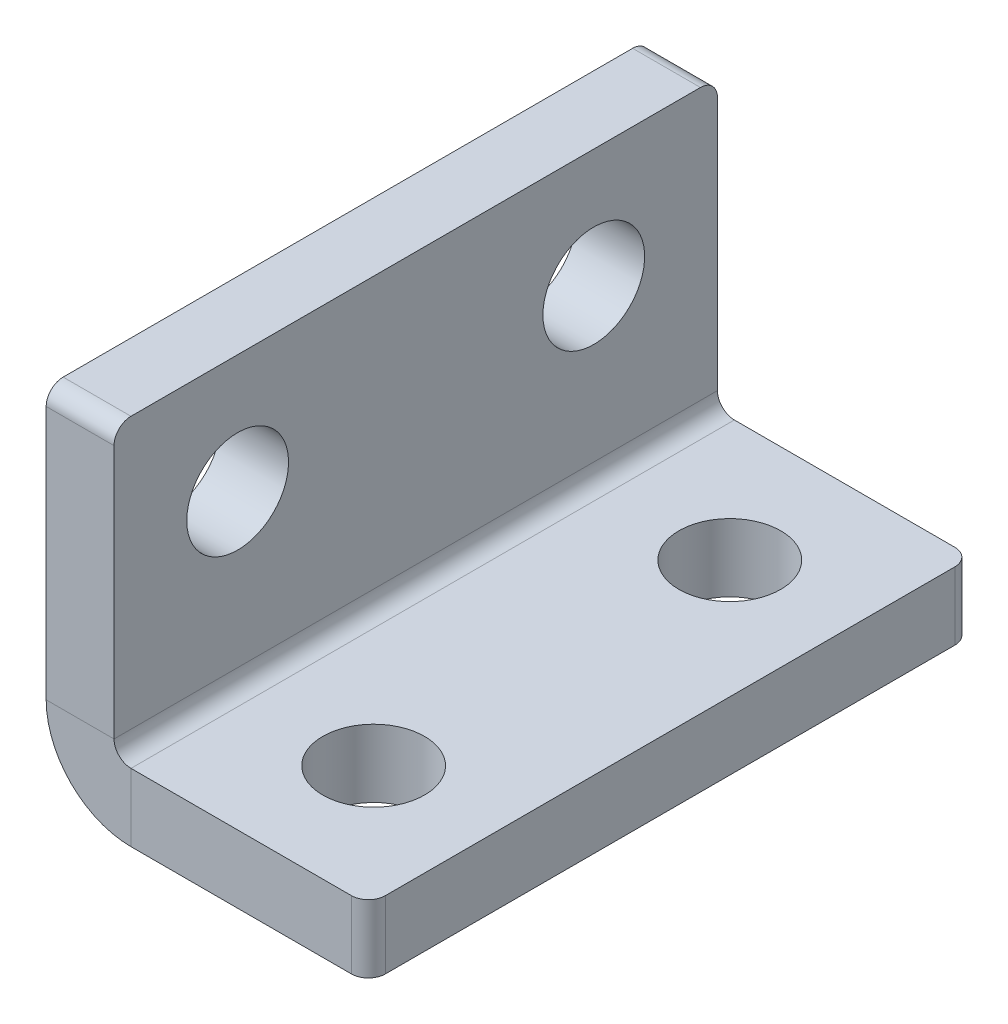
ISO-10303-21;
HEADER;
FILE_DESCRIPTION(('STEP AP214'),'2;1');
FILE_NAME('part.step','',(''),(''),'','','');
FILE_SCHEMA(('AUTOMOTIVE_DESIGN { 1 0 10303 214 1 1 1 1 }'));
ENDSEC;
DATA;
#1=APPLICATION_CONTEXT('core data for automotive mechanical design processes');
#2=APPLICATION_PROTOCOL_DEFINITION('international standard','automotive_design',2000,#1);
#3=PRODUCT_CONTEXT('',#1,'mechanical');
#4=PRODUCT('Part','Part','',(#3));
#5=PRODUCT_RELATED_PRODUCT_CATEGORY('part','',(#4));
#6=PRODUCT_DEFINITION_FORMATION('','',#4);
#7=PRODUCT_DEFINITION_CONTEXT('part definition',#1,'design');
#8=PRODUCT_DEFINITION('design','',#6,#7);
#9=PRODUCT_DEFINITION_SHAPE('','',#8);
#10=(LENGTH_UNIT() NAMED_UNIT(*) SI_UNIT(.MILLI.,.METRE.));
#11=(NAMED_UNIT(*) PLANE_ANGLE_UNIT() SI_UNIT($,.RADIAN.));
#12=(NAMED_UNIT(*) SI_UNIT($,.STERADIAN.) SOLID_ANGLE_UNIT());
#13=UNCERTAINTY_MEASURE_WITH_UNIT(LENGTH_MEASURE(1.E-05),#10,'distance_accuracy_value','');
#14=(GEOMETRIC_REPRESENTATION_CONTEXT(3) GLOBAL_UNCERTAINTY_ASSIGNED_CONTEXT((#13)) GLOBAL_UNIT_ASSIGNED_CONTEXT((#10,
#11,#12)) REPRESENTATION_CONTEXT('',''));
#15=CARTESIAN_POINT('',(0.,0.,0.));
#16=DIRECTION('',(0.,0.,1.));
#17=DIRECTION('',(1.,0.,0.));
#18=AXIS2_PLACEMENT_3D('',#15,#16,#17);
#19=CARTESIAN_POINT('',(5.50000000000002,8.49,-17.79));
#20=DIRECTION('',(0.,0.,-1.));
#21=DIRECTION('',(0.,1.,0.));
#22=AXIS2_PLACEMENT_3D('',#19,#20,#21);
#23=PLANE('',#22);
#24=DIRECTION('',(0.,1.,0.));
#25=VECTOR('',#24,1.);
#26=CARTESIAN_POINT('',(5.50000000000002,8.49,-17.79));
#27=LINE('',#26,#25);
#28=CARTESIAN_POINT('',(5.49999999999999,0.499999999999848,-17.79));
#29=VERTEX_POINT('',#28);
#30=CARTESIAN_POINT('',(5.50000000000002,7.99,-17.79));
#31=VERTEX_POINT('',#30);
#32=EDGE_CURVE('E141',#29,#31,#27,.T.);
#33=ORIENTED_EDGE('',*,*,#32,.T.);
#34=DIRECTION('',(1.,0.,0.));
#35=VECTOR('',#34,1.);
#36=CARTESIAN_POINT('',(5.50000000000002,7.99,-17.79));
#37=LINE('',#36,#35);
#38=CARTESIAN_POINT('',(7.50000000000002,7.99,-17.79));
#39=VERTEX_POINT('',#38);
#40=EDGE_CURVE('E176',#31,#39,#37,.T.);
#41=ORIENTED_EDGE('',*,*,#40,.T.);
#42=DIRECTION('',(0.,1.,0.));
#43=VECTOR('',#42,1.);
#44=CARTESIAN_POINT('',(7.50000000000002,8.49,-17.79));
#45=LINE('',#44,#43);
#46=CARTESIAN_POINT('',(7.49999999999999,0.49999999999997,-17.79));
#47=VERTEX_POINT('',#46);
#48=EDGE_CURVE('E165',#47,#39,#45,.T.);
#49=ORIENTED_EDGE('',*,*,#48,.F.);
#50=DIRECTION('',(-1.,0.,0.));
#51=VECTOR('',#50,1.);
#52=CARTESIAN_POINT('',(5.49999999999999,0.500000000000009,-17.79));
#53=LINE('',#52,#51);
#54=EDGE_CURVE('E140',#47,#29,#53,.T.);
#55=ORIENTED_EDGE('',*,*,#54,.T.);
#56=EDGE_LOOP('',(#33,#41,#49,#55));
#57=FACE_BOUND('',#56,.T.);
#58=ADVANCED_FACE('F39',(#57),#23,.T.);
#59=CARTESIAN_POINT('',(5.50000000000002,8.49,0.));
#60=DIRECTION('',(0.,0.,1.));
#61=DIRECTION('',(0.,-1.,0.));
#62=AXIS2_PLACEMENT_3D('',#59,#60,#61);
#63=PLANE('',#62);
#64=DIRECTION('',(0.,-1.,0.));
#65=VECTOR('',#64,1.);
#66=CARTESIAN_POINT('',(7.50000000000002,8.49,0.));
#67=LINE('',#66,#65);
#68=CARTESIAN_POINT('',(7.50000000000002,7.99,0.));
#69=VERTEX_POINT('',#68);
#70=CARTESIAN_POINT('',(7.49999999999999,0.49999999999997,0.));
#71=VERTEX_POINT('',#70);
#72=EDGE_CURVE('E179',#69,#71,#67,.T.);
#73=ORIENTED_EDGE('',*,*,#72,.F.);
#74=DIRECTION('',(1.,0.,0.));
#75=VECTOR('',#74,1.);
#76=CARTESIAN_POINT('',(5.50000000000002,7.99,0.));
#77=LINE('',#76,#75);
#78=CARTESIAN_POINT('',(5.50000000000002,7.99,0.));
#79=VERTEX_POINT('',#78);
#80=EDGE_CURVE('E196',#69,#79,#77,.F.);
#81=ORIENTED_EDGE('',*,*,#80,.T.);
#82=DIRECTION('',(0.,-1.,0.));
#83=VECTOR('',#82,1.);
#84=CARTESIAN_POINT('',(5.50000000000002,8.49,0.));
#85=LINE('',#84,#83);
#86=CARTESIAN_POINT('',(5.49999999999999,0.500000000000009,0.));
#87=VERTEX_POINT('',#86);
#88=EDGE_CURVE('E161',#79,#87,#85,.T.);
#89=ORIENTED_EDGE('',*,*,#88,.T.);
#90=DIRECTION('',(1.,0.,0.));
#91=VECTOR('',#90,1.);
#92=CARTESIAN_POINT('',(5.49999999999999,0.500000000000009,0.));
#93=LINE('',#92,#91);
#94=EDGE_CURVE('E170',#87,#71,#93,.T.);
#95=ORIENTED_EDGE('',*,*,#94,.T.);
#96=EDGE_LOOP('',(#73,#81,#89,#95));
#97=FACE_BOUND('',#96,.T.);
#98=ADVANCED_FACE('F299',(#97),#63,.T.);
#99=CARTESIAN_POINT('',(5.50000000000002,8.49,0.));
#100=DIRECTION('',(-1.,0.,0.));
#101=DIRECTION('',(0.,0.,-1.));
#102=AXIS2_PLACEMENT_3D('',#99,#100,#101);
#103=PLANE('',#102);
#104=CARTESIAN_POINT('',(5.50000000000001,5.00000000000001,-14.145));
#105=DIRECTION('',(1.,0.,0.));
#106=DIRECTION('',(0.,0.,1.));
#107=AXIS2_PLACEMENT_3D('',#104,#105,#106);
#108=CIRCLE('',#107,1.5);
#109=CARTESIAN_POINT('',(5.50000000000001,5.00000000000001,-12.645));
#110=VERTEX_POINT('',#109);
#111=EDGE_CURVE('E266',#110,#110,#108,.T.);
#112=ORIENTED_EDGE('',*,*,#111,.T.);
#113=EDGE_LOOP('',(#112));
#114=FACE_BOUND('',#113,.T.);
#115=CARTESIAN_POINT('',(5.50000000000001,5.00000000000001,-3.645));
#116=DIRECTION('',(1.,0.,0.));
#117=DIRECTION('',(0.,0.,1.));
#118=AXIS2_PLACEMENT_3D('',#115,#116,#117);
#119=CIRCLE('',#118,1.5);
#120=CARTESIAN_POINT('',(5.50000000000001,5.00000000000001,-2.145));
#121=VERTEX_POINT('',#120);
#122=EDGE_CURVE('E272',#121,#121,#119,.T.);
#123=ORIENTED_EDGE('',*,*,#122,.T.);
#124=EDGE_LOOP('',(#123));
#125=FACE_BOUND('',#124,.T.);
#126=DIRECTION('',(0.,0.,1.));
#127=VECTOR('',#126,1.);
#128=CARTESIAN_POINT('',(5.50000000000002,8.49,0.));
#129=LINE('',#128,#127);
#130=CARTESIAN_POINT('',(5.50000000000002,8.49,-17.29));
#131=VERTEX_POINT('',#130);
#132=CARTESIAN_POINT('',(5.50000000000002,8.49,-0.5));
#133=VERTEX_POINT('',#132);
#134=EDGE_CURVE('E178',#131,#133,#129,.T.);
#135=ORIENTED_EDGE('',*,*,#134,.F.);
#136=CARTESIAN_POINT('',(5.50000000000002,7.99,-17.29));
#137=DIRECTION('',(-1.,0.,0.));
#138=DIRECTION('',(0.,-1.,0.));
#139=AXIS2_PLACEMENT_3D('',#136,#137,#138);
#140=CIRCLE('',#139,0.5);
#141=EDGE_CURVE('E157',#131,#31,#140,.T.);
#142=ORIENTED_EDGE('',*,*,#141,.T.);
#143=ORIENTED_EDGE('',*,*,#32,.F.);
#144=DIRECTION('',(0.,0.,1.));
#145=VECTOR('',#144,1.);
#146=CARTESIAN_POINT('',(5.49999999999999,0.500000000000009,0.));
#147=LINE('',#146,#145);
#148=EDGE_CURVE('E129',#29,#87,#147,.T.);
#149=ORIENTED_EDGE('',*,*,#148,.T.);
#150=ORIENTED_EDGE('',*,*,#88,.F.);
#151=CARTESIAN_POINT('',(5.50000000000002,7.99,-0.5));
#152=DIRECTION('',(-1.,0.,0.));
#153=DIRECTION('',(0.,-1.,0.));
#154=AXIS2_PLACEMENT_3D('',#151,#152,#153);
#155=CIRCLE('',#154,0.5);
#156=EDGE_CURVE('E193',#79,#133,#155,.T.);
#157=ORIENTED_EDGE('',*,*,#156,.T.);
#158=EDGE_LOOP('',(#135,#142,#143,#149,#150,#157));
#159=FACE_BOUND('',#158,.T.);
#160=ADVANCED_FACE('F155',(#114,#125,#159),#103,.T.);
#161=CARTESIAN_POINT('',(5.50000000000002,8.49,0.));
#162=DIRECTION('',(0.,1.,0.));
#163=DIRECTION('',(0.,0.,1.));
#164=AXIS2_PLACEMENT_3D('',#161,#162,#163);
#165=PLANE('',#164);
#166=DIRECTION('',(0.,0.,1.));
#167=VECTOR('',#166,1.);
#168=CARTESIAN_POINT('',(7.50000000000002,8.49,0.));
#169=LINE('',#168,#167);
#170=CARTESIAN_POINT('',(7.50000000000002,8.49,-17.29));
#171=VERTEX_POINT('',#170);
#172=CARTESIAN_POINT('',(7.50000000000002,8.49,-0.5));
#173=VERTEX_POINT('',#172);
#174=EDGE_CURVE('E181',#171,#173,#169,.T.);
#175=ORIENTED_EDGE('',*,*,#174,.F.);
#176=DIRECTION('',(1.,0.,0.));
#177=VECTOR('',#176,1.);
#178=CARTESIAN_POINT('',(5.50000000000002,8.49,-17.29));
#179=LINE('',#178,#177);
#180=EDGE_CURVE('E191',#171,#131,#179,.F.);
#181=ORIENTED_EDGE('',*,*,#180,.T.);
#182=ORIENTED_EDGE('',*,*,#134,.T.);
#183=DIRECTION('',(1.,0.,0.));
#184=VECTOR('',#183,1.);
#185=CARTESIAN_POINT('',(5.50000000000002,8.49,-0.5));
#186=LINE('',#185,#184);
#187=EDGE_CURVE('E188',#133,#173,#186,.T.);
#188=ORIENTED_EDGE('',*,*,#187,.T.);
#189=EDGE_LOOP('',(#175,#181,#182,#188));
#190=FACE_BOUND('',#189,.T.);
#191=ADVANCED_FACE('F286',(#190),#165,.T.);
#192=CARTESIAN_POINT('',(7.50000000000002,8.49,0.));
#193=DIRECTION('',(-1.,0.,0.));
#194=DIRECTION('',(0.,0.,-1.));
#195=AXIS2_PLACEMENT_3D('',#192,#193,#194);
#196=PLANE('',#195);
#197=ORIENTED_EDGE('',*,*,#48,.T.);
#198=CARTESIAN_POINT('',(7.50000000000002,7.99,-17.29));
#199=DIRECTION('',(-1.,0.,0.));
#200=DIRECTION('',(0.,-1.,0.));
#201=AXIS2_PLACEMENT_3D('',#198,#199,#200);
#202=CIRCLE('',#201,0.5);
#203=EDGE_CURVE('E186',#39,#171,#202,.F.);
#204=ORIENTED_EDGE('',*,*,#203,.T.);
#205=ORIENTED_EDGE('',*,*,#174,.T.);
#206=CARTESIAN_POINT('',(7.50000000000002,7.99,-0.5));
#207=DIRECTION('',(-1.,0.,0.));
#208=DIRECTION('',(0.,-1.,0.));
#209=AXIS2_PLACEMENT_3D('',#206,#207,#208);
#210=CIRCLE('',#209,0.5);
#211=EDGE_CURVE('E184',#173,#69,#210,.F.);
#212=ORIENTED_EDGE('',*,*,#211,.T.);
#213=ORIENTED_EDGE('',*,*,#72,.T.);
#214=DIRECTION('',(0.,0.,1.));
#215=VECTOR('',#214,1.);
#216=CARTESIAN_POINT('',(7.49999999999999,0.500000000000002,0.));
#217=LINE('',#216,#215);
#218=EDGE_CURVE('E167',#47,#71,#217,.T.);
#219=ORIENTED_EDGE('',*,*,#218,.F.);
#220=EDGE_LOOP('',(#197,#204,#205,#212,#213,#219));
#221=FACE_BOUND('',#220,.T.);
#222=CARTESIAN_POINT('',(7.50000000000001,5.,-14.145));
#223=DIRECTION('',(1.,0.,0.));
#224=DIRECTION('',(0.,0.,1.));
#225=AXIS2_PLACEMENT_3D('',#222,#223,#224);
#226=CIRCLE('',#225,1.5);
#227=CARTESIAN_POINT('',(7.50000000000001,5.,-12.645));
#228=VERTEX_POINT('',#227);
#229=EDGE_CURVE('E226',#228,#228,#226,.T.);
#230=ORIENTED_EDGE('',*,*,#229,.F.);
#231=EDGE_LOOP('',(#230));
#232=FACE_BOUND('',#231,.T.);
#233=CARTESIAN_POINT('',(7.50000000000001,5.,-3.645));
#234=DIRECTION('',(1.,0.,0.));
#235=DIRECTION('',(0.,0.,1.));
#236=AXIS2_PLACEMENT_3D('',#233,#234,#235);
#237=CIRCLE('',#236,1.5);
#238=CARTESIAN_POINT('',(7.50000000000001,5.,-2.145));
#239=VERTEX_POINT('',#238);
#240=EDGE_CURVE('E269',#239,#239,#237,.T.);
#241=ORIENTED_EDGE('',*,*,#240,.F.);
#242=EDGE_LOOP('',(#241));
#243=FACE_BOUND('',#242,.T.);
#244=ADVANCED_FACE('F281',(#221,#232,#243),#196,.F.);
#245=CARTESIAN_POINT('',(5.50000000000001,5.00000000000001,-3.645));
#246=DIRECTION('',(1.,0.,0.));
#247=DIRECTION('',(0.,0.,1.));
#248=AXIS2_PLACEMENT_3D('',#245,#246,#247);
#249=CYLINDRICAL_SURFACE('',#248,1.5);
#250=ORIENTED_EDGE('',*,*,#122,.F.);
#251=EDGE_LOOP('',(#250));
#252=FACE_BOUND('',#251,.T.);
#253=ORIENTED_EDGE('',*,*,#240,.T.);
#254=EDGE_LOOP('',(#253));
#255=FACE_BOUND('',#254,.T.);
#256=ADVANCED_FACE('F321',(#252,#255),#249,.F.);
#257=CARTESIAN_POINT('',(5.50000000000001,5.00000000000001,-14.145));
#258=DIRECTION('',(1.,0.,0.));
#259=DIRECTION('',(0.,0.,1.));
#260=AXIS2_PLACEMENT_3D('',#257,#258,#259);
#261=CYLINDRICAL_SURFACE('',#260,1.5);
#262=ORIENTED_EDGE('',*,*,#111,.F.);
#263=EDGE_LOOP('',(#262));
#264=FACE_BOUND('',#263,.T.);
#265=ORIENTED_EDGE('',*,*,#229,.T.);
#266=EDGE_LOOP('',(#265));
#267=FACE_BOUND('',#266,.T.);
#268=ADVANCED_FACE('F326',(#264,#267),#261,.F.);
#269=CARTESIAN_POINT('',(11.51,-2.,-14.145));
#270=DIRECTION('',(0.,1.,0.));
#271=DIRECTION('',(0.,0.,1.));
#272=AXIS2_PLACEMENT_3D('',#269,#270,#271);
#273=CYLINDRICAL_SURFACE('',#272,1.5);
#274=CARTESIAN_POINT('',(11.51,-2.,-14.145));
#275=DIRECTION('',(0.,1.,0.));
#276=DIRECTION('',(0.,0.,1.));
#277=AXIS2_PLACEMENT_3D('',#274,#275,#276);
#278=CIRCLE('',#277,1.5);
#279=CARTESIAN_POINT('',(11.51,-2.,-12.645));
#280=VERTEX_POINT('',#279);
#281=EDGE_CURVE('E249',#280,#280,#278,.T.);
#282=ORIENTED_EDGE('',*,*,#281,.F.);
#283=EDGE_LOOP('',(#282));
#284=FACE_BOUND('',#283,.T.);
#285=CARTESIAN_POINT('',(11.51,0.,-14.145));
#286=DIRECTION('',(0.,1.,0.));
#287=DIRECTION('',(0.,0.,1.));
#288=AXIS2_PLACEMENT_3D('',#285,#286,#287);
#289=CIRCLE('',#288,1.5);
#290=CARTESIAN_POINT('',(11.51,0.,-12.645));
#291=VERTEX_POINT('',#290);
#292=EDGE_CURVE('E259',#291,#291,#289,.T.);
#293=ORIENTED_EDGE('',*,*,#292,.T.);
#294=EDGE_LOOP('',(#293));
#295=FACE_BOUND('',#294,.T.);
#296=ADVANCED_FACE('F336',(#284,#295),#273,.F.);
#297=CARTESIAN_POINT('',(11.51,-2.,-3.645));
#298=DIRECTION('',(0.,1.,0.));
#299=DIRECTION('',(0.,0.,1.));
#300=AXIS2_PLACEMENT_3D('',#297,#298,#299);
#301=CYLINDRICAL_SURFACE('',#300,1.5);
#302=CARTESIAN_POINT('',(11.51,-2.,-3.645));
#303=DIRECTION('',(0.,1.,0.));
#304=DIRECTION('',(0.,0.,1.));
#305=AXIS2_PLACEMENT_3D('',#302,#303,#304);
#306=CIRCLE('',#305,1.5);
#307=CARTESIAN_POINT('',(11.51,-2.,-2.145));
#308=VERTEX_POINT('',#307);
#309=EDGE_CURVE('E252',#308,#308,#306,.T.);
#310=ORIENTED_EDGE('',*,*,#309,.F.);
#311=EDGE_LOOP('',(#310));
#312=FACE_BOUND('',#311,.T.);
#313=CARTESIAN_POINT('',(11.51,0.,-3.645));
#314=DIRECTION('',(0.,1.,0.));
#315=DIRECTION('',(0.,0.,1.));
#316=AXIS2_PLACEMENT_3D('',#313,#314,#315);
#317=CIRCLE('',#316,1.5);
#318=CARTESIAN_POINT('',(11.51,0.,-2.145));
#319=VERTEX_POINT('',#318);
#320=EDGE_CURVE('E256',#319,#319,#317,.T.);
#321=ORIENTED_EDGE('',*,*,#320,.T.);
#322=EDGE_LOOP('',(#321));
#323=FACE_BOUND('',#322,.T.);
#324=ADVANCED_FACE('F350',(#312,#323),#301,.F.);
#325=CARTESIAN_POINT('',(15.,-2.,0.));
#326=DIRECTION('',(1.,0.,0.));
#327=DIRECTION('',(0.,0.,-1.));
#328=AXIS2_PLACEMENT_3D('',#325,#326,#327);
#329=PLANE('',#328);
#330=DIRECTION('',(0.,0.,-1.));
#331=VECTOR('',#330,1.);
#332=CARTESIAN_POINT('',(15.,0.,0.));
#333=LINE('',#332,#331);
#334=CARTESIAN_POINT('',(15.,0.,-0.499999999999997));
#335=VERTEX_POINT('',#334);
#336=CARTESIAN_POINT('',(15.,0.,-17.29));
#337=VERTEX_POINT('',#336);
#338=EDGE_CURVE('E227',#335,#337,#333,.T.);
#339=ORIENTED_EDGE('',*,*,#338,.F.);
#340=DIRECTION('',(0.,1.,0.));
#341=VECTOR('',#340,1.);
#342=CARTESIAN_POINT('',(15.,-2.,-0.499999999999997));
#343=LINE('',#342,#341);
#344=CARTESIAN_POINT('',(15.,-2.,-0.499999999999997));
#345=VERTEX_POINT('',#344);
#346=EDGE_CURVE('E208',#335,#345,#343,.F.);
#347=ORIENTED_EDGE('',*,*,#346,.T.);
#348=DIRECTION('',(0.,0.,-1.));
#349=VECTOR('',#348,1.);
#350=CARTESIAN_POINT('',(15.,-2.,0.));
#351=LINE('',#350,#349);
#352=CARTESIAN_POINT('',(15.,-2.,-17.29));
#353=VERTEX_POINT('',#352);
#354=EDGE_CURVE('E217',#345,#353,#351,.T.);
#355=ORIENTED_EDGE('',*,*,#354,.T.);
#356=DIRECTION('',(0.,1.,0.));
#357=VECTOR('',#356,1.);
#358=CARTESIAN_POINT('',(15.,-2.,-17.29));
#359=LINE('',#358,#357);
#360=EDGE_CURVE('E205',#353,#337,#359,.T.);
#361=ORIENTED_EDGE('',*,*,#360,.T.);
#362=EDGE_LOOP('',(#339,#347,#355,#361));
#363=FACE_BOUND('',#362,.T.);
#364=ADVANCED_FACE('F237',(#363),#329,.T.);
#365=CARTESIAN_POINT('',(0.,-2.,0.));
#366=DIRECTION('',(0.,-1.,0.));
#367=DIRECTION('',(0.,0.,-1.));
#368=AXIS2_PLACEMENT_3D('',#365,#366,#367);
#369=PLANE('',#368);
#370=ORIENTED_EDGE('',*,*,#354,.F.);
#371=CARTESIAN_POINT('',(14.5,-2.,-0.499999999999997));
#372=DIRECTION('',(0.,-1.,0.));
#373=DIRECTION('',(0.,0.,-1.));
#374=AXIS2_PLACEMENT_3D('',#371,#372,#373);
#375=CIRCLE('',#374,0.5);
#376=CARTESIAN_POINT('',(14.5,-2.,0.));
#377=VERTEX_POINT('',#376);
#378=EDGE_CURVE('E47',#345,#377,#375,.T.);
#379=ORIENTED_EDGE('',*,*,#378,.T.);
#380=DIRECTION('',(1.,0.,0.));
#381=VECTOR('',#380,1.);
#382=CARTESIAN_POINT('',(0.,-2.,0.));
#383=LINE('',#382,#381);
#384=CARTESIAN_POINT('',(7.99999999999999,-2.,0.));
#385=VERTEX_POINT('',#384);
#386=EDGE_CURVE('E215',#385,#377,#383,.T.);
#387=ORIENTED_EDGE('',*,*,#386,.F.);
#388=DIRECTION('',(0.,0.,1.));
#389=VECTOR('',#388,1.);
#390=CARTESIAN_POINT('',(7.99999999999999,-2.,0.));
#391=LINE('',#390,#389);
#392=CARTESIAN_POINT('',(7.99999999999999,-2.,-17.79));
#393=VERTEX_POINT('',#392);
#394=EDGE_CURVE('E264',#393,#385,#391,.T.);
#395=ORIENTED_EDGE('',*,*,#394,.F.);
#396=DIRECTION('',(-1.,0.,0.));
#397=VECTOR('',#396,1.);
#398=CARTESIAN_POINT('',(0.,-2.,-17.79));
#399=LINE('',#398,#397);
#400=CARTESIAN_POINT('',(14.5,-2.,-17.79));
#401=VERTEX_POINT('',#400);
#402=EDGE_CURVE('E247',#401,#393,#399,.T.);
#403=ORIENTED_EDGE('',*,*,#402,.F.);
#404=CARTESIAN_POINT('',(14.5,-2.,-17.29));
#405=DIRECTION('',(0.,-1.,0.));
#406=DIRECTION('',(0.,0.,-1.));
#407=AXIS2_PLACEMENT_3D('',#404,#405,#406);
#408=CIRCLE('',#407,0.5);
#409=EDGE_CURVE('E59',#401,#353,#408,.T.);
#410=ORIENTED_EDGE('',*,*,#409,.T.);
#411=EDGE_LOOP('',(#370,#379,#387,#395,#403,#410));
#412=FACE_BOUND('',#411,.T.);
#413=ORIENTED_EDGE('',*,*,#309,.T.);
#414=EDGE_LOOP('',(#413));
#415=FACE_BOUND('',#414,.T.);
#416=ORIENTED_EDGE('',*,*,#281,.T.);
#417=EDGE_LOOP('',(#416));
#418=FACE_BOUND('',#417,.T.);
#419=ADVANCED_FACE('F212',(#412,#415,#418),#369,.T.);
#420=CARTESIAN_POINT('',(0.,-2.,-17.79));
#421=DIRECTION('',(0.,0.,-1.));
#422=DIRECTION('',(-1.,0.,0.));
#423=AXIS2_PLACEMENT_3D('',#420,#421,#422);
#424=PLANE('',#423);
#425=DIRECTION('',(-1.,0.,0.));
#426=VECTOR('',#425,1.);
#427=CARTESIAN_POINT('',(0.,0.,-17.79));
#428=LINE('',#427,#426);
#429=CARTESIAN_POINT('',(14.5,0.,-17.79));
#430=VERTEX_POINT('',#429);
#431=CARTESIAN_POINT('',(7.99999999999999,0.,-17.79));
#432=VERTEX_POINT('',#431);
#433=EDGE_CURVE('E245',#430,#432,#428,.T.);
#434=ORIENTED_EDGE('',*,*,#433,.F.);
#435=DIRECTION('',(0.,1.,0.));
#436=VECTOR('',#435,1.);
#437=CARTESIAN_POINT('',(14.5,-2.,-17.79));
#438=LINE('',#437,#436);
#439=EDGE_CURVE('E12',#430,#401,#438,.F.);
#440=ORIENTED_EDGE('',*,*,#439,.T.);
#441=ORIENTED_EDGE('',*,*,#402,.T.);
#442=DIRECTION('',(0.,-1.,0.));
#443=VECTOR('',#442,1.);
#444=CARTESIAN_POINT('',(7.99999999999999,-2.,-17.79));
#445=LINE('',#444,#443);
#446=EDGE_CURVE('E150',#432,#393,#445,.T.);
#447=ORIENTED_EDGE('',*,*,#446,.F.);
#448=EDGE_LOOP('',(#434,#440,#441,#447));
#449=FACE_BOUND('',#448,.T.);
#450=ADVANCED_FACE('F342',(#449),#424,.T.);
#451=CARTESIAN_POINT('',(0.,0.,0.));
#452=DIRECTION('',(0.,-1.,0.));
#453=DIRECTION('',(0.,0.,-1.));
#454=AXIS2_PLACEMENT_3D('',#451,#452,#453);
#455=PLANE('',#454);
#456=ORIENTED_EDGE('',*,*,#292,.F.);
#457=EDGE_LOOP('',(#456));
#458=FACE_BOUND('',#457,.T.);
#459=ORIENTED_EDGE('',*,*,#320,.F.);
#460=EDGE_LOOP('',(#459));
#461=FACE_BOUND('',#460,.T.);
#462=DIRECTION('',(1.,0.,0.));
#463=VECTOR('',#462,1.);
#464=CARTESIAN_POINT('',(0.,0.,0.));
#465=LINE('',#464,#463);
#466=CARTESIAN_POINT('',(7.99999999999999,0.,0.));
#467=VERTEX_POINT('',#466);
#468=CARTESIAN_POINT('',(14.5,0.,0.));
#469=VERTEX_POINT('',#468);
#470=EDGE_CURVE('E235',#467,#469,#465,.T.);
#471=ORIENTED_EDGE('',*,*,#470,.T.);
#472=CARTESIAN_POINT('',(14.5,0.,-0.499999999999997));
#473=DIRECTION('',(0.,-1.,0.));
#474=DIRECTION('',(0.,0.,-1.));
#475=AXIS2_PLACEMENT_3D('',#472,#473,#474);
#476=CIRCLE('',#475,0.5);
#477=EDGE_CURVE('E203',#469,#335,#476,.F.);
#478=ORIENTED_EDGE('',*,*,#477,.T.);
#479=ORIENTED_EDGE('',*,*,#338,.T.);
#480=CARTESIAN_POINT('',(14.5,0.,-17.29));
#481=DIRECTION('',(0.,-1.,0.));
#482=DIRECTION('',(0.,0.,-1.));
#483=AXIS2_PLACEMENT_3D('',#480,#481,#482);
#484=CIRCLE('',#483,0.5);
#485=EDGE_CURVE('E201',#337,#430,#484,.F.);
#486=ORIENTED_EDGE('',*,*,#485,.T.);
#487=ORIENTED_EDGE('',*,*,#433,.T.);
#488=DIRECTION('',(0.,0.,1.));
#489=VECTOR('',#488,1.);
#490=CARTESIAN_POINT('',(7.99999999999999,0.,0.));
#491=LINE('',#490,#489);
#492=EDGE_CURVE('E240',#432,#467,#491,.T.);
#493=ORIENTED_EDGE('',*,*,#492,.T.);
#494=EDGE_LOOP('',(#471,#478,#479,#486,#487,#493));
#495=FACE_BOUND('',#494,.T.);
#496=ADVANCED_FACE('F233',(#458,#461,#495),#455,.F.);
#497=CARTESIAN_POINT('',(0.,-2.,0.));
#498=DIRECTION('',(0.,0.,1.));
#499=DIRECTION('',(1.,0.,0.));
#500=AXIS2_PLACEMENT_3D('',#497,#498,#499);
#501=PLANE('',#500);
#502=ORIENTED_EDGE('',*,*,#386,.T.);
#503=DIRECTION('',(0.,1.,0.));
#504=VECTOR('',#503,1.);
#505=CARTESIAN_POINT('',(14.5,-2.,0.));
#506=LINE('',#505,#504);
#507=EDGE_CURVE('E198',#377,#469,#506,.T.);
#508=ORIENTED_EDGE('',*,*,#507,.T.);
#509=ORIENTED_EDGE('',*,*,#470,.F.);
#510=DIRECTION('',(0.,1.,0.));
#511=VECTOR('',#510,1.);
#512=CARTESIAN_POINT('',(7.99999999999999,-2.,0.));
#513=LINE('',#512,#511);
#514=EDGE_CURVE('E225',#385,#467,#513,.T.);
#515=ORIENTED_EDGE('',*,*,#514,.F.);
#516=EDGE_LOOP('',(#502,#508,#509,#515));
#517=FACE_BOUND('',#516,.T.);
#518=ADVANCED_FACE('F222',(#517),#501,.T.);
#519=CARTESIAN_POINT('',(7.99999999999999,0.5,-17.79));
#520=DIRECTION('',(0.,0.,-1.));
#521=DIRECTION('',(-1.,0.,0.));
#522=AXIS2_PLACEMENT_3D('',#519,#520,#521);
#523=PLANE('',#522);
#524=ORIENTED_EDGE('',*,*,#54,.F.);
#525=CARTESIAN_POINT('',(7.99999999999999,0.5,-17.79));
#526=DIRECTION('',(0.,0.,-1.));
#527=DIRECTION('',(-1.,0.,0.));
#528=AXIS2_PLACEMENT_3D('',#525,#526,#527);
#529=CIRCLE('',#528,0.5);
#530=EDGE_CURVE('E295',#47,#432,#529,.F.);
#531=ORIENTED_EDGE('',*,*,#530,.T.);
#532=ORIENTED_EDGE('',*,*,#446,.T.);
#533=CARTESIAN_POINT('',(7.99999999999999,0.5,-17.79));
#534=DIRECTION('',(0.,0.,1.));
#535=DIRECTION('',(-1.,0.,0.));
#536=AXIS2_PLACEMENT_3D('',#533,#534,#535);
#537=CIRCLE('',#536,2.5);
#538=EDGE_CURVE('E133',#29,#393,#537,.T.);
#539=ORIENTED_EDGE('',*,*,#538,.F.);
#540=EDGE_LOOP('',(#524,#531,#532,#539));
#541=FACE_BOUND('',#540,.T.);
#542=ADVANCED_FACE('F145',(#541),#523,.T.);
#543=CARTESIAN_POINT('',(7.99999999999999,0.5,0.));
#544=DIRECTION('',(0.,0.,1.));
#545=DIRECTION('',(1.,0.,0.));
#546=AXIS2_PLACEMENT_3D('',#543,#544,#545);
#547=PLANE('',#546);
#548=CARTESIAN_POINT('',(7.99999999999999,0.5,0.));
#549=DIRECTION('',(0.,0.,-1.));
#550=DIRECTION('',(-1.,0.,0.));
#551=AXIS2_PLACEMENT_3D('',#548,#549,#550);
#552=CIRCLE('',#551,0.5);
#553=EDGE_CURVE('E151',#467,#71,#552,.T.);
#554=ORIENTED_EDGE('',*,*,#553,.T.);
#555=ORIENTED_EDGE('',*,*,#94,.F.);
#556=CARTESIAN_POINT('',(7.99999999999999,0.5,0.));
#557=DIRECTION('',(0.,0.,-1.));
#558=DIRECTION('',(1.,0.,0.));
#559=AXIS2_PLACEMENT_3D('',#556,#557,#558);
#560=CIRCLE('',#559,2.5);
#561=EDGE_CURVE('E135',#385,#87,#560,.T.);
#562=ORIENTED_EDGE('',*,*,#561,.F.);
#563=ORIENTED_EDGE('',*,*,#514,.T.);
#564=EDGE_LOOP('',(#554,#555,#562,#563));
#565=FACE_BOUND('',#564,.T.);
#566=ADVANCED_FACE('F297',(#565),#547,.T.);
#567=CARTESIAN_POINT('',(7.99999999999999,0.5,9.00707250571844));
#568=DIRECTION('',(0.,0.,-1.));
#569=DIRECTION('',(-1.,0.,0.));
#570=AXIS2_PLACEMENT_3D('',#567,#568,#569);
#571=CYLINDRICAL_SURFACE('',#570,2.5);
#572=ORIENTED_EDGE('',*,*,#394,.T.);
#573=ORIENTED_EDGE('',*,*,#561,.T.);
#574=ORIENTED_EDGE('',*,*,#148,.F.);
#575=ORIENTED_EDGE('',*,*,#538,.T.);
#576=EDGE_LOOP('',(#572,#573,#574,#575));
#577=FACE_BOUND('',#576,.T.);
#578=ADVANCED_FACE('F132',(#577),#571,.T.);
#579=CARTESIAN_POINT('',(7.99999999999999,0.5,9.00707250571844));
#580=DIRECTION('',(0.,0.,-1.));
#581=DIRECTION('',(-1.,0.,0.));
#582=AXIS2_PLACEMENT_3D('',#579,#580,#581);
#583=CYLINDRICAL_SURFACE('',#582,0.5);
#584=ORIENTED_EDGE('',*,*,#492,.F.);
#585=ORIENTED_EDGE('',*,*,#530,.F.);
#586=ORIENTED_EDGE('',*,*,#218,.T.);
#587=ORIENTED_EDGE('',*,*,#553,.F.);
#588=EDGE_LOOP('',(#584,#585,#586,#587));
#589=FACE_BOUND('',#588,.T.);
#590=ADVANCED_FACE('F294',(#589),#583,.F.);
#591=CARTESIAN_POINT('',(5.50000000000002,7.99,-17.29));
#592=DIRECTION('',(1.,0.,0.));
#593=DIRECTION('',(0.,1.,0.));
#594=AXIS2_PLACEMENT_3D('',#591,#592,#593);
#595=CYLINDRICAL_SURFACE('',#594,0.5);
#596=ORIENTED_EDGE('',*,*,#141,.F.);
#597=ORIENTED_EDGE('',*,*,#180,.F.);
#598=ORIENTED_EDGE('',*,*,#203,.F.);
#599=ORIENTED_EDGE('',*,*,#40,.F.);
#600=EDGE_LOOP('',(#596,#597,#598,#599));
#601=FACE_BOUND('',#600,.T.);
#602=ADVANCED_FACE('F289',(#601),#595,.T.);
#603=CARTESIAN_POINT('',(5.50000000000002,7.99,-0.5));
#604=DIRECTION('',(1.,0.,0.));
#605=DIRECTION('',(0.,1.,0.));
#606=AXIS2_PLACEMENT_3D('',#603,#604,#605);
#607=CYLINDRICAL_SURFACE('',#606,0.5);
#608=ORIENTED_EDGE('',*,*,#156,.F.);
#609=ORIENTED_EDGE('',*,*,#80,.F.);
#610=ORIENTED_EDGE('',*,*,#211,.F.);
#611=ORIENTED_EDGE('',*,*,#187,.F.);
#612=EDGE_LOOP('',(#608,#609,#610,#611));
#613=FACE_BOUND('',#612,.T.);
#614=ADVANCED_FACE('F303',(#613),#607,.T.);
#615=CARTESIAN_POINT('',(14.5,-2.,-0.499999999999997));
#616=DIRECTION('',(0.,1.,0.));
#617=DIRECTION('',(0.,0.,1.));
#618=AXIS2_PLACEMENT_3D('',#615,#616,#617);
#619=CYLINDRICAL_SURFACE('',#618,0.5);
#620=ORIENTED_EDGE('',*,*,#378,.F.);
#621=ORIENTED_EDGE('',*,*,#346,.F.);
#622=ORIENTED_EDGE('',*,*,#477,.F.);
#623=ORIENTED_EDGE('',*,*,#507,.F.);
#624=EDGE_LOOP('',(#620,#621,#622,#623));
#625=FACE_BOUND('',#624,.T.);
#626=ADVANCED_FACE('F229',(#625),#619,.T.);
#627=CARTESIAN_POINT('',(14.5,-2.,-17.29));
#628=DIRECTION('',(0.,1.,0.));
#629=DIRECTION('',(0.,0.,1.));
#630=AXIS2_PLACEMENT_3D('',#627,#628,#629);
#631=CYLINDRICAL_SURFACE('',#630,0.5);
#632=ORIENTED_EDGE('',*,*,#409,.F.);
#633=ORIENTED_EDGE('',*,*,#439,.F.);
#634=ORIENTED_EDGE('',*,*,#485,.F.);
#635=ORIENTED_EDGE('',*,*,#360,.F.);
#636=EDGE_LOOP('',(#632,#633,#634,#635));
#637=FACE_BOUND('',#636,.T.);
#638=ADVANCED_FACE('F41',(#637),#631,.T.);
#639=CLOSED_SHELL('',(#58,#98,#160,#191,#244,#256,#268,#296,#324,#364,#419,#450,#496,#518,#542,
#566,#578,#590,#602,#614,#626,#638));
#640=MANIFOLD_SOLID_BREP('B2',#639);
#641=ADVANCED_BREP_SHAPE_REPRESENTATION('',(#18,#640),#14);
#642=SHAPE_DEFINITION_REPRESENTATION(#9,#641);
ENDSEC;
END-ISO-10303-21;
